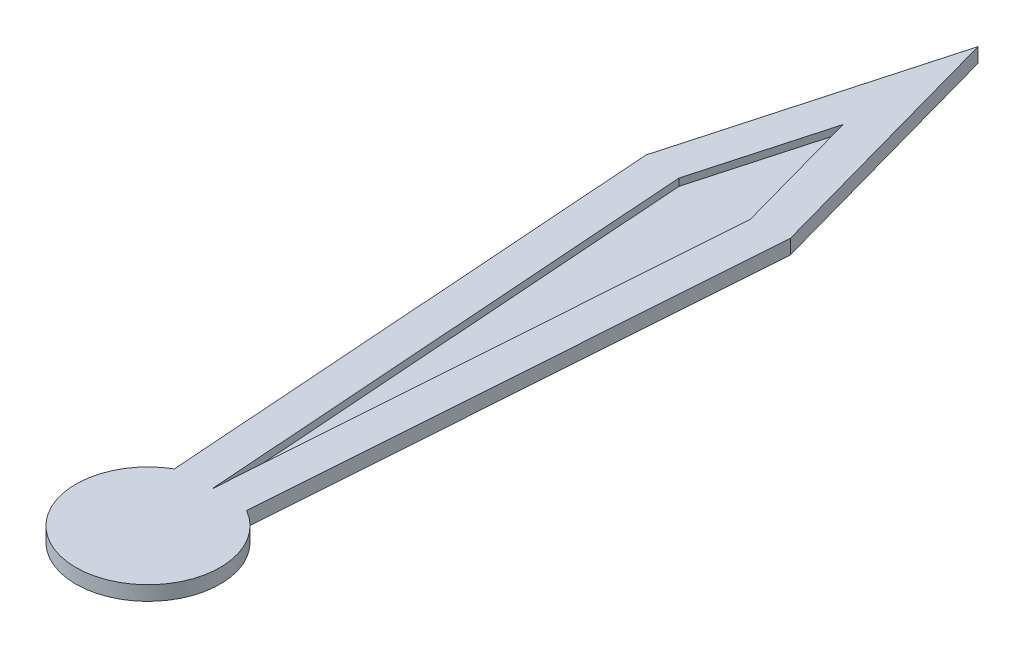
ISO-10303-21;
HEADER;
FILE_DESCRIPTION(('STEP AP214'),'2;1');
FILE_NAME('part.step','',(''),(''),'','','');
FILE_SCHEMA(('AUTOMOTIVE_DESIGN { 1 0 10303 214 1 1 1 1 }'));
ENDSEC;
DATA;
#1=APPLICATION_CONTEXT('core data for automotive mechanical design processes');
#2=APPLICATION_PROTOCOL_DEFINITION('international standard','automotive_design',2000,#1);
#3=PRODUCT_CONTEXT('',#1,'mechanical');
#4=PRODUCT('Part','Part','',(#3));
#5=PRODUCT_RELATED_PRODUCT_CATEGORY('part','',(#4));
#6=PRODUCT_DEFINITION_FORMATION('','',#4);
#7=PRODUCT_DEFINITION_CONTEXT('part definition',#1,'design');
#8=PRODUCT_DEFINITION('design','',#6,#7);
#9=PRODUCT_DEFINITION_SHAPE('','',#8);
#10=(LENGTH_UNIT() NAMED_UNIT(*) SI_UNIT(.MILLI.,.METRE.));
#11=(NAMED_UNIT(*) PLANE_ANGLE_UNIT() SI_UNIT($,.RADIAN.));
#12=(NAMED_UNIT(*) SI_UNIT($,.STERADIAN.) SOLID_ANGLE_UNIT());
#13=UNCERTAINTY_MEASURE_WITH_UNIT(LENGTH_MEASURE(1.E-05),#10,'distance_accuracy_value','');
#14=(GEOMETRIC_REPRESENTATION_CONTEXT(3) GLOBAL_UNCERTAINTY_ASSIGNED_CONTEXT((#13)) GLOBAL_UNIT_ASSIGNED_CONTEXT((#10,
#11,#12)) REPRESENTATION_CONTEXT('',''));
#15=CARTESIAN_POINT('',(0.,0.,0.));
#16=DIRECTION('',(0.,0.,1.));
#17=DIRECTION('',(1.,0.,0.));
#18=AXIS2_PLACEMENT_3D('',#15,#16,#17);
#19=CARTESIAN_POINT('',(0.,0.2,-11.5));
#20=DIRECTION('',(0.96351790962994,0.,0.267643863786095));
#21=DIRECTION('',(0.267643863786095,0.,-0.963517909629941));
#22=AXIS2_PLACEMENT_3D('',#19,#20,#21);
#23=PLANE('',#22);
#24=DIRECTION('',(-0.267643863786095,0.,0.96351790962994));
#25=VECTOR('',#24,1.);
#26=CARTESIAN_POINT('',(0.,0.,-11.5));
#27=LINE('',#26,#25);
#28=CARTESIAN_POINT('',(0.,0.,-11.5));
#29=VERTEX_POINT('',#28);
#30=CARTESIAN_POINT('',(-1.,0.,-7.9));
#31=VERTEX_POINT('',#30);
#32=EDGE_CURVE('E125',#29,#31,#27,.T.);
#33=ORIENTED_EDGE('',*,*,#32,.T.);
#34=DIRECTION('',(0.,-1.,0.));
#35=VECTOR('',#34,1.);
#36=CARTESIAN_POINT('',(-1.,0.2,-7.9));
#37=LINE('',#36,#35);
#38=CARTESIAN_POINT('',(-1.,0.2,-7.9));
#39=VERTEX_POINT('',#38);
#40=EDGE_CURVE('E11',#39,#31,#37,.T.);
#41=ORIENTED_EDGE('',*,*,#40,.F.);
#42=DIRECTION('',(-0.267643863786095,0.,0.96351790962994));
#43=VECTOR('',#42,1.);
#44=CARTESIAN_POINT('',(0.,0.2,-11.5));
#45=LINE('',#44,#43);
#46=CARTESIAN_POINT('',(0.,0.2,-11.5));
#47=VERTEX_POINT('',#46);
#48=EDGE_CURVE('E138',#47,#39,#45,.T.);
#49=ORIENTED_EDGE('',*,*,#48,.F.);
#50=DIRECTION('',(0.,-1.,0.));
#51=VECTOR('',#50,1.);
#52=CARTESIAN_POINT('',(0.,0.2,-11.5));
#53=LINE('',#52,#51);
#54=EDGE_CURVE('E121',#47,#29,#53,.T.);
#55=ORIENTED_EDGE('',*,*,#54,.T.);
#56=EDGE_LOOP('',(#33,#41,#49,#55));
#57=FACE_BOUND('',#56,.T.);
#58=ADVANCED_FACE('F37',(#57),#23,.F.);
#59=CARTESIAN_POINT('',(-1.,0.2,-7.9));
#60=DIRECTION('',(0.997483097482806,0.,-0.0709046559550751));
#61=DIRECTION('',(-0.0709046559550751,0.,-0.997483097482806));
#62=AXIS2_PLACEMENT_3D('',#59,#60,#61);
#63=PLANE('',#62);
#64=DIRECTION('',(0.0709046559550751,0.,0.997483097482806));
#65=VECTOR('',#64,1.);
#66=CARTESIAN_POINT('',(-1.,0.,-7.9));
#67=LINE('',#66,#65);
#68=CARTESIAN_POINT('',(-0.5,0.,-0.866025403784439));
#69=VERTEX_POINT('',#68);
#70=EDGE_CURVE('E128',#31,#69,#67,.T.);
#71=ORIENTED_EDGE('',*,*,#70,.T.);
#72=DIRECTION('',(0.,-1.,0.));
#73=VECTOR('',#72,1.);
#74=CARTESIAN_POINT('',(-0.5,0.2,-0.866025403784439));
#75=LINE('',#74,#73);
#76=CARTESIAN_POINT('',(-0.5,0.2,-0.866025403784439));
#77=VERTEX_POINT('',#76);
#78=EDGE_CURVE('E44',#77,#69,#75,.T.);
#79=ORIENTED_EDGE('',*,*,#78,.F.);
#80=DIRECTION('',(0.0709046559550751,0.,0.997483097482806));
#81=VECTOR('',#80,1.);
#82=CARTESIAN_POINT('',(-1.,0.2,-7.9));
#83=LINE('',#82,#81);
#84=EDGE_CURVE('E92',#39,#77,#83,.T.);
#85=ORIENTED_EDGE('',*,*,#84,.F.);
#86=ORIENTED_EDGE('',*,*,#40,.T.);
#87=EDGE_LOOP('',(#71,#79,#85,#86));
#88=FACE_BOUND('',#87,.T.);
#89=ADVANCED_FACE('F239',(#88),#63,.F.);
#90=CARTESIAN_POINT('',(0.,0.2,0.));
#91=DIRECTION('',(0.,-1.,0.));
#92=DIRECTION('',(0.,0.,-1.));
#93=AXIS2_PLACEMENT_3D('',#90,#91,#92);
#94=CYLINDRICAL_SURFACE('',#93,1.);
#95=CARTESIAN_POINT('',(0.,0.,0.));
#96=DIRECTION('',(0.,1.,0.));
#97=DIRECTION('',(0.,0.,1.));
#98=AXIS2_PLACEMENT_3D('',#95,#96,#97);
#99=CIRCLE('',#98,1.);
#100=CARTESIAN_POINT('',(0.5,0.,-0.866025403784439));
#101=VERTEX_POINT('',#100);
#102=EDGE_CURVE('E113',#69,#101,#99,.T.);
#103=ORIENTED_EDGE('',*,*,#102,.T.);
#104=DIRECTION('',(0.,-1.,0.));
#105=VECTOR('',#104,1.);
#106=CARTESIAN_POINT('',(0.5,0.2,-0.866025403784439));
#107=LINE('',#106,#105);
#108=CARTESIAN_POINT('',(0.5,0.2,-0.866025403784439));
#109=VERTEX_POINT('',#108);
#110=EDGE_CURVE('E110',#109,#101,#107,.T.);
#111=ORIENTED_EDGE('',*,*,#110,.F.);
#112=CARTESIAN_POINT('',(0.,0.2,0.));
#113=DIRECTION('',(0.,1.,0.));
#114=DIRECTION('',(0.,0.,1.));
#115=AXIS2_PLACEMENT_3D('',#112,#113,#114);
#116=CIRCLE('',#115,1.);
#117=EDGE_CURVE('E99',#77,#109,#116,.T.);
#118=ORIENTED_EDGE('',*,*,#117,.F.);
#119=ORIENTED_EDGE('',*,*,#78,.T.);
#120=EDGE_LOOP('',(#103,#111,#118,#119));
#121=FACE_BOUND('',#120,.T.);
#122=ADVANCED_FACE('F111',(#121),#94,.T.);
#123=CARTESIAN_POINT('',(1.,0.2,-7.9));
#124=DIRECTION('',(-0.997483097482806,0.,-0.0709046559550751));
#125=DIRECTION('',(-0.0709046559550751,0.,0.997483097482806));
#126=AXIS2_PLACEMENT_3D('',#123,#124,#125);
#127=PLANE('',#126);
#128=DIRECTION('',(0.0709046559550751,0.,-0.997483097482806));
#129=VECTOR('',#128,1.);
#130=CARTESIAN_POINT('',(1.,0.,-7.9));
#131=LINE('',#130,#129);
#132=CARTESIAN_POINT('',(1.,0.,-7.9));
#133=VERTEX_POINT('',#132);
#134=EDGE_CURVE('E134',#101,#133,#131,.T.);
#135=ORIENTED_EDGE('',*,*,#134,.T.);
#136=DIRECTION('',(0.,-1.,0.));
#137=VECTOR('',#136,1.);
#138=CARTESIAN_POINT('',(1.,0.2,-7.9));
#139=LINE('',#138,#137);
#140=CARTESIAN_POINT('',(1.,0.2,-7.9));
#141=VERTEX_POINT('',#140);
#142=EDGE_CURVE('E116',#141,#133,#139,.T.);
#143=ORIENTED_EDGE('',*,*,#142,.F.);
#144=DIRECTION('',(0.0709046559550751,0.,-0.997483097482806));
#145=VECTOR('',#144,1.);
#146=CARTESIAN_POINT('',(1.,0.2,-7.9));
#147=LINE('',#146,#145);
#148=EDGE_CURVE('E103',#109,#141,#147,.T.);
#149=ORIENTED_EDGE('',*,*,#148,.F.);
#150=ORIENTED_EDGE('',*,*,#110,.T.);
#151=EDGE_LOOP('',(#135,#143,#149,#150));
#152=FACE_BOUND('',#151,.T.);
#153=ADVANCED_FACE('F118',(#152),#127,.F.);
#154=CARTESIAN_POINT('',(0.,0.2,-11.5));
#155=DIRECTION('',(-0.96351790962994,0.,0.267643863786095));
#156=DIRECTION('',(0.267643863786095,0.,0.963517909629941));
#157=AXIS2_PLACEMENT_3D('',#154,#155,#156);
#158=PLANE('',#157);
#159=DIRECTION('',(-0.267643863786095,0.,-0.96351790962994));
#160=VECTOR('',#159,1.);
#161=CARTESIAN_POINT('',(0.,0.,-11.5));
#162=LINE('',#161,#160);
#163=EDGE_CURVE('E84',#133,#29,#162,.T.);
#164=ORIENTED_EDGE('',*,*,#163,.T.);
#165=ORIENTED_EDGE('',*,*,#54,.F.);
#166=DIRECTION('',(-0.267643863786095,0.,-0.96351790962994));
#167=VECTOR('',#166,1.);
#168=CARTESIAN_POINT('',(0.,0.2,-11.5));
#169=LINE('',#168,#167);
#170=EDGE_CURVE('E60',#141,#47,#169,.T.);
#171=ORIENTED_EDGE('',*,*,#170,.F.);
#172=ORIENTED_EDGE('',*,*,#142,.T.);
#173=EDGE_LOOP('',(#164,#165,#171,#172));
#174=FACE_BOUND('',#173,.T.);
#175=ADVANCED_FACE('F143',(#174),#158,.F.);
#176=CARTESIAN_POINT('',(0.,0.2,0.));
#177=DIRECTION('',(0.,1.,0.));
#178=DIRECTION('',(0.,0.,1.));
#179=AXIS2_PLACEMENT_3D('',#176,#177,#178);
#180=PLANE('',#179);
#181=DIRECTION('',(-0.267643863786095,0.,0.963517909629941));
#182=VECTOR('',#181,1.);
#183=CARTESIAN_POINT('',(0.,0.2,-9.63184583077306));
#184=LINE('',#183,#182);
#185=CARTESIAN_POINT('',(0.,0.2,-9.63184583077306));
#186=VERTEX_POINT('',#185);
#187=CARTESIAN_POINT('',(-0.495137937748079,0.2,-7.84934925487998));
#188=VERTEX_POINT('',#187);
#189=EDGE_CURVE('E51',#186,#188,#184,.T.);
#190=ORIENTED_EDGE('',*,*,#189,.F.);
#191=DIRECTION('',(-0.267643863786095,0.,-0.963517909629941));
#192=VECTOR('',#191,1.);
#193=CARTESIAN_POINT('',(0.495137937748079,0.2,-7.84934925487998));
#194=LINE('',#193,#192);
#195=CARTESIAN_POINT('',(0.495137937748079,0.2,-7.84934925487998));
#196=VERTEX_POINT('',#195);
#197=EDGE_CURVE('E163',#196,#186,#194,.T.);
#198=ORIENTED_EDGE('',*,*,#197,.F.);
#199=DIRECTION('',(0.0709046559550752,0.,-0.997483097482806));
#200=VECTOR('',#199,1.);
#201=CARTESIAN_POINT('',(0.00125845125859675,0.2,-0.901477731761976));
#202=LINE('',#201,#200);
#203=CARTESIAN_POINT('',(0.00125845125859675,0.2,-0.901477731761976));
#204=VERTEX_POINT('',#203);
#205=EDGE_CURVE('E167',#204,#196,#202,.T.);
#206=ORIENTED_EDGE('',*,*,#205,.F.);
#207=DIRECTION('',(1.,0.,-1.20615163369307E-12));
#208=VECTOR('',#207,1.);
#209=CARTESIAN_POINT('',(-0.00125845125859697,0.2,-0.901477731761973));
#210=LINE('',#209,#208);
#211=CARTESIAN_POINT('',(-0.00125845125859697,0.2,-0.901477731761973));
#212=VERTEX_POINT('',#211);
#213=EDGE_CURVE('E170',#212,#204,#210,.T.);
#214=ORIENTED_EDGE('',*,*,#213,.F.);
#215=DIRECTION('',(0.0709046559550751,0.,0.997483097482806));
#216=VECTOR('',#215,1.);
#217=CARTESIAN_POINT('',(-0.495137937748079,0.2,-7.84934925487998));
#218=LINE('',#217,#216);
#219=EDGE_CURVE('E173',#188,#212,#218,.T.);
#220=ORIENTED_EDGE('',*,*,#219,.F.);
#221=EDGE_LOOP('',(#190,#198,#206,#214,#220));
#222=FACE_BOUND('',#221,.T.);
#223=ORIENTED_EDGE('',*,*,#48,.T.);
#224=ORIENTED_EDGE('',*,*,#84,.T.);
#225=ORIENTED_EDGE('',*,*,#117,.T.);
#226=ORIENTED_EDGE('',*,*,#148,.T.);
#227=ORIENTED_EDGE('',*,*,#170,.T.);
#228=EDGE_LOOP('',(#223,#224,#225,#226,#227));
#229=FACE_BOUND('',#228,.T.);
#230=ADVANCED_FACE('F101',(#222,#229),#180,.T.);
#231=CARTESIAN_POINT('',(0.,0.,0.));
#232=DIRECTION('',(0.,1.,0.));
#233=DIRECTION('',(0.,0.,1.));
#234=AXIS2_PLACEMENT_3D('',#231,#232,#233);
#235=PLANE('',#234);
#236=ORIENTED_EDGE('',*,*,#32,.F.);
#237=ORIENTED_EDGE('',*,*,#163,.F.);
#238=ORIENTED_EDGE('',*,*,#134,.F.);
#239=ORIENTED_EDGE('',*,*,#102,.F.);
#240=ORIENTED_EDGE('',*,*,#70,.F.);
#241=EDGE_LOOP('',(#236,#237,#238,#239,#240));
#242=FACE_BOUND('',#241,.T.);
#243=ADVANCED_FACE('F142',(#242),#235,.F.);
#244=CARTESIAN_POINT('',(0.,0.1,-9.63184583077306));
#245=DIRECTION('',(-0.963517909629941,0.,-0.267643863786095));
#246=DIRECTION('',(-0.267643863786095,0.,0.963517909629941));
#247=AXIS2_PLACEMENT_3D('',#244,#245,#246);
#248=PLANE('',#247);
#249=ORIENTED_EDGE('',*,*,#189,.T.);
#250=DIRECTION('',(0.,1.,0.));
#251=VECTOR('',#250,1.);
#252=CARTESIAN_POINT('',(-0.495137937748079,0.1,-7.84934925487998));
#253=LINE('',#252,#251);
#254=CARTESIAN_POINT('',(-0.495137937748079,0.1,-7.84934925487998));
#255=VERTEX_POINT('',#254);
#256=EDGE_CURVE('E150',#255,#188,#253,.T.);
#257=ORIENTED_EDGE('',*,*,#256,.F.);
#258=DIRECTION('',(-0.267643863786095,0.,0.963517909629941));
#259=VECTOR('',#258,1.);
#260=CARTESIAN_POINT('',(0.,0.1,-9.63184583077306));
#261=LINE('',#260,#259);
#262=CARTESIAN_POINT('',(0.,0.1,-9.63184583077306));
#263=VERTEX_POINT('',#262);
#264=EDGE_CURVE('E166',#263,#255,#261,.T.);
#265=ORIENTED_EDGE('',*,*,#264,.F.);
#266=DIRECTION('',(0.,1.,0.));
#267=VECTOR('',#266,1.);
#268=CARTESIAN_POINT('',(0.,0.1,-9.63184583077306));
#269=LINE('',#268,#267);
#270=EDGE_CURVE('E129',#263,#186,#269,.T.);
#271=ORIENTED_EDGE('',*,*,#270,.T.);
#272=EDGE_LOOP('',(#249,#257,#265,#271));
#273=FACE_BOUND('',#272,.T.);
#274=ADVANCED_FACE('F199',(#273),#248,.F.);
#275=CARTESIAN_POINT('',(0.495137937748079,0.1,-7.84934925487998));
#276=DIRECTION('',(0.963517909629941,0.,-0.267643863786095));
#277=DIRECTION('',(-0.267643863786095,0.,-0.963517909629941));
#278=AXIS2_PLACEMENT_3D('',#275,#276,#277);
#279=PLANE('',#278);
#280=ORIENTED_EDGE('',*,*,#197,.T.);
#281=ORIENTED_EDGE('',*,*,#270,.F.);
#282=DIRECTION('',(-0.267643863786095,0.,-0.963517909629941));
#283=VECTOR('',#282,1.);
#284=CARTESIAN_POINT('',(0.495137937748079,0.1,-7.84934925487998));
#285=LINE('',#284,#283);
#286=CARTESIAN_POINT('',(0.495137937748079,0.1,-7.84934925487998));
#287=VERTEX_POINT('',#286);
#288=EDGE_CURVE('E153',#287,#263,#285,.T.);
#289=ORIENTED_EDGE('',*,*,#288,.F.);
#290=DIRECTION('',(0.,1.,0.));
#291=VECTOR('',#290,1.);
#292=CARTESIAN_POINT('',(0.495137937748079,0.1,-7.84934925487998));
#293=LINE('',#292,#291);
#294=EDGE_CURVE('E159',#287,#196,#293,.T.);
#295=ORIENTED_EDGE('',*,*,#294,.T.);
#296=EDGE_LOOP('',(#280,#281,#289,#295));
#297=FACE_BOUND('',#296,.T.);
#298=ADVANCED_FACE('F213',(#297),#279,.F.);
#299=CARTESIAN_POINT('',(0.00125845125859675,0.1,-0.901477731761976));
#300=DIRECTION('',(0.997483097482806,0.,0.0709046559550752));
#301=DIRECTION('',(0.0709046559550752,0.,-0.997483097482806));
#302=AXIS2_PLACEMENT_3D('',#299,#300,#301);
#303=PLANE('',#302);
#304=ORIENTED_EDGE('',*,*,#205,.T.);
#305=ORIENTED_EDGE('',*,*,#294,.F.);
#306=DIRECTION('',(0.0709046559550752,0.,-0.997483097482806));
#307=VECTOR('',#306,1.);
#308=CARTESIAN_POINT('',(0.00125845125859675,0.1,-0.901477731761976));
#309=LINE('',#308,#307);
#310=CARTESIAN_POINT('',(0.00125845125859675,0.1,-0.901477731761976));
#311=VERTEX_POINT('',#310);
#312=EDGE_CURVE('E180',#311,#287,#309,.T.);
#313=ORIENTED_EDGE('',*,*,#312,.F.);
#314=DIRECTION('',(0.,1.,0.));
#315=VECTOR('',#314,1.);
#316=CARTESIAN_POINT('',(0.00125845125859675,0.1,-0.901477731761976));
#317=LINE('',#316,#315);
#318=EDGE_CURVE('E156',#311,#204,#317,.T.);
#319=ORIENTED_EDGE('',*,*,#318,.T.);
#320=EDGE_LOOP('',(#304,#305,#313,#319));
#321=FACE_BOUND('',#320,.T.);
#322=ADVANCED_FACE('F218',(#321),#303,.F.);
#323=CARTESIAN_POINT('',(-0.00125845125859697,0.1,-0.901477731761973));
#324=DIRECTION('',(1.20615163369307E-12,0.,1.));
#325=DIRECTION('',(1.,0.,-1.20615163369307E-12));
#326=AXIS2_PLACEMENT_3D('',#323,#324,#325);
#327=PLANE('',#326);
#328=ORIENTED_EDGE('',*,*,#213,.T.);
#329=ORIENTED_EDGE('',*,*,#318,.F.);
#330=DIRECTION('',(1.,0.,-1.20615163369307E-12));
#331=VECTOR('',#330,1.);
#332=CARTESIAN_POINT('',(-0.00125845125859697,0.1,-0.901477731761973));
#333=LINE('',#332,#331);
#334=CARTESIAN_POINT('',(-0.00125845125859697,0.1,-0.901477731761973));
#335=VERTEX_POINT('',#334);
#336=EDGE_CURVE('E183',#335,#311,#333,.T.);
#337=ORIENTED_EDGE('',*,*,#336,.F.);
#338=DIRECTION('',(0.,1.,0.));
#339=VECTOR('',#338,1.);
#340=CARTESIAN_POINT('',(-0.00125845125859697,0.1,-0.901477731761973));
#341=LINE('',#340,#339);
#342=EDGE_CURVE('E152',#335,#212,#341,.T.);
#343=ORIENTED_EDGE('',*,*,#342,.T.);
#344=EDGE_LOOP('',(#328,#329,#337,#343));
#345=FACE_BOUND('',#344,.T.);
#346=ADVANCED_FACE('F229',(#345),#327,.F.);
#347=CARTESIAN_POINT('',(-0.495137937748079,0.1,-7.84934925487998));
#348=DIRECTION('',(-0.997483097482806,0.,0.0709046559550751));
#349=DIRECTION('',(0.0709046559550751,0.,0.997483097482806));
#350=AXIS2_PLACEMENT_3D('',#347,#348,#349);
#351=PLANE('',#350);
#352=ORIENTED_EDGE('',*,*,#219,.T.);
#353=ORIENTED_EDGE('',*,*,#342,.F.);
#354=DIRECTION('',(0.0709046559550751,0.,0.997483097482806));
#355=VECTOR('',#354,1.);
#356=CARTESIAN_POINT('',(-0.495137937748079,0.1,-7.84934925487998));
#357=LINE('',#356,#355);
#358=EDGE_CURVE('E186',#255,#335,#357,.T.);
#359=ORIENTED_EDGE('',*,*,#358,.F.);
#360=ORIENTED_EDGE('',*,*,#256,.T.);
#361=EDGE_LOOP('',(#352,#353,#359,#360));
#362=FACE_BOUND('',#361,.T.);
#363=ADVANCED_FACE('F225',(#362),#351,.F.);
#364=CARTESIAN_POINT('',(0.,0.1,0.));
#365=DIRECTION('',(0.,1.,0.));
#366=DIRECTION('',(0.,0.,1.));
#367=AXIS2_PLACEMENT_3D('',#364,#365,#366);
#368=PLANE('',#367);
#369=ORIENTED_EDGE('',*,*,#264,.T.);
#370=ORIENTED_EDGE('',*,*,#358,.T.);
#371=ORIENTED_EDGE('',*,*,#336,.T.);
#372=ORIENTED_EDGE('',*,*,#312,.T.);
#373=ORIENTED_EDGE('',*,*,#288,.T.);
#374=EDGE_LOOP('',(#369,#370,#371,#372,#373));
#375=FACE_BOUND('',#374,.T.);
#376=ADVANCED_FACE('F194',(#375),#368,.T.);
#377=CLOSED_SHELL('',(#58,#89,#122,#153,#175,#230,#243,#274,#298,#322,#346,#363,#376));
#378=MANIFOLD_SOLID_BREP('B2',#377);
#379=ADVANCED_BREP_SHAPE_REPRESENTATION('',(#18,#378),#14);
#380=SHAPE_DEFINITION_REPRESENTATION(#9,#379);
ENDSEC;
END-ISO-10303-21;
